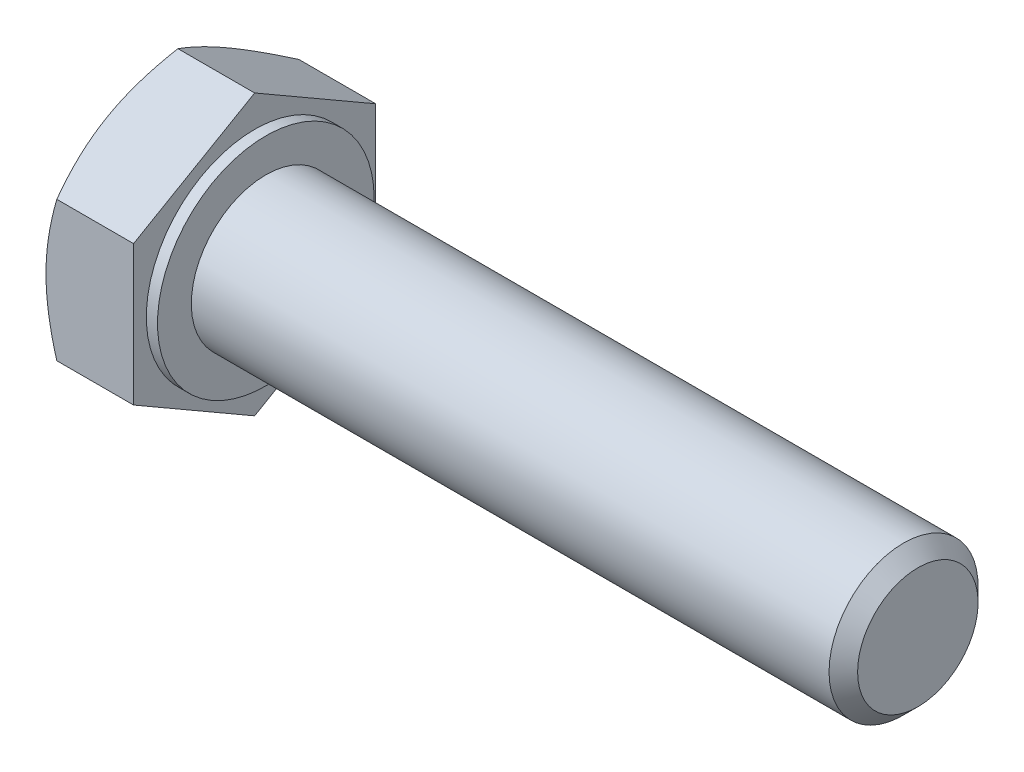
ISO-10303-21;
HEADER;
FILE_DESCRIPTION(('STEP AP214'),'2;1');
FILE_NAME('part.step','',(''),(''),'','','');
FILE_SCHEMA(('AUTOMOTIVE_DESIGN { 1 0 10303 214 1 1 1 1 }'));
ENDSEC;
DATA;
#1=APPLICATION_CONTEXT('core data for automotive mechanical design processes');
#2=APPLICATION_PROTOCOL_DEFINITION('international standard','automotive_design',2000,#1);
#3=PRODUCT_CONTEXT('',#1,'mechanical');
#4=PRODUCT('Part','Part','',(#3));
#5=PRODUCT_RELATED_PRODUCT_CATEGORY('part','',(#4));
#6=PRODUCT_DEFINITION_FORMATION('','',#4);
#7=PRODUCT_DEFINITION_CONTEXT('part definition',#1,'design');
#8=PRODUCT_DEFINITION('design','',#6,#7);
#9=PRODUCT_DEFINITION_SHAPE('','',#8);
#10=(LENGTH_UNIT() NAMED_UNIT(*) SI_UNIT(.MILLI.,.METRE.));
#11=(NAMED_UNIT(*) PLANE_ANGLE_UNIT() SI_UNIT($,.RADIAN.));
#12=(NAMED_UNIT(*) SI_UNIT($,.STERADIAN.) SOLID_ANGLE_UNIT());
#13=UNCERTAINTY_MEASURE_WITH_UNIT(LENGTH_MEASURE(1.E-05),#10,'distance_accuracy_value','');
#14=(GEOMETRIC_REPRESENTATION_CONTEXT(3) GLOBAL_UNCERTAINTY_ASSIGNED_CONTEXT((#13)) GLOBAL_UNIT_ASSIGNED_CONTEXT((#10,
#11,#12)) REPRESENTATION_CONTEXT('',''));
#15=CARTESIAN_POINT('',(0.,0.,0.));
#16=DIRECTION('',(0.,0.,1.));
#17=DIRECTION('',(1.,0.,0.));
#18=AXIS2_PLACEMENT_3D('',#15,#16,#17);
#19=CARTESIAN_POINT('',(35.,2.,0.));
#20=DIRECTION('',(1.,0.,0.));
#21=DIRECTION('',(0.,0.,-1.));
#22=AXIS2_PLACEMENT_3D('',#19,#20,#21);
#23=PLANE('',#22);
#24=CARTESIAN_POINT('',(35.0000000051362,0.,0.));
#25=DIRECTION('',(-1.,0.,0.));
#26=DIRECTION('',(0.,0.,1.));
#27=AXIS2_PLACEMENT_3D('',#24,#25,#26);
#28=CIRCLE('',#27,3.23318750513691);
#29=CARTESIAN_POINT('',(35.0000000051362,0.,3.23318750513691));
#30=VERTEX_POINT('',#29);
#31=EDGE_CURVE('E20',#30,#30,#28,.T.);
#32=ORIENTED_EDGE('',*,*,#31,.F.);
#33=EDGE_LOOP('',(#32));
#34=FACE_BOUND('',#33,.T.);
#35=ADVANCED_FACE('F17',(#34),#23,.T.);
#36=CARTESIAN_POINT('',(-5.30009999999999,0.,0.));
#37=DIRECTION('',(-1.,0.,0.));
#38=DIRECTION('',(0.,0.,1.));
#39=AXIS2_PLACEMENT_3D('',#36,#37,#38);
#40=PLANE('',#39);
#41=CARTESIAN_POINT('',(-5.30010000898123,0.,0.));
#42=DIRECTION('',(1.,0.,0.));
#43=DIRECTION('',(0.,0.,-1.));
#44=AXIS2_PLACEMENT_3D('',#41,#42,#43);
#45=CIRCLE('',#44,6.50000000518535);
#46=CARTESIAN_POINT('',(-5.30010001047811,-5.62916512684417,3.25000000129633));
#47=VERTEX_POINT('',#46);
#48=CARTESIAN_POINT('',(-5.30010001047811,-5.62916512684417,-3.25000000129634));
#49=VERTEX_POINT('',#48);
#50=EDGE_CURVE('E93',#47,#49,#45,.T.);
#51=ORIENTED_EDGE('',*,*,#50,.F.);
#52=CARTESIAN_POINT('',(-5.30010000898123,0.,0.));
#53=DIRECTION('',(1.,0.,0.));
#54=DIRECTION('',(0.,0.,-1.));
#55=AXIS2_PLACEMENT_3D('',#52,#53,#54);
#56=CIRCLE('',#55,6.50000000518535);
#57=CARTESIAN_POINT('',(-5.30010001047811,0.,6.50000000259268));
#58=VERTEX_POINT('',#57);
#59=EDGE_CURVE('E89',#58,#47,#56,.T.);
#60=ORIENTED_EDGE('',*,*,#59,.F.);
#61=CARTESIAN_POINT('',(-5.30010000898123,0.,0.));
#62=DIRECTION('',(1.,0.,0.));
#63=DIRECTION('',(0.,0.,-1.));
#64=AXIS2_PLACEMENT_3D('',#61,#62,#63);
#65=CIRCLE('',#64,6.50000000518535);
#66=CARTESIAN_POINT('',(-5.30010001047811,5.62916512684417,3.25000000129634));
#67=VERTEX_POINT('',#66);
#68=EDGE_CURVE('E86',#67,#58,#65,.T.);
#69=ORIENTED_EDGE('',*,*,#68,.F.);
#70=CARTESIAN_POINT('',(-5.30010000898123,0.,0.));
#71=DIRECTION('',(1.,0.,0.));
#72=DIRECTION('',(0.,0.,-1.));
#73=AXIS2_PLACEMENT_3D('',#70,#71,#72);
#74=CIRCLE('',#73,6.50000000518535);
#75=CARTESIAN_POINT('',(-5.30010001047811,5.62916512684417,-3.25000000129633));
#76=VERTEX_POINT('',#75);
#77=EDGE_CURVE('E165',#76,#67,#74,.T.);
#78=ORIENTED_EDGE('',*,*,#77,.F.);
#79=CARTESIAN_POINT('',(-5.30010000898123,0.,0.));
#80=DIRECTION('',(1.,0.,0.));
#81=DIRECTION('',(0.,0.,-1.));
#82=AXIS2_PLACEMENT_3D('',#79,#80,#81);
#83=CIRCLE('',#82,6.50000000518535);
#84=CARTESIAN_POINT('',(-5.30010001047811,0.,-6.50000000259267));
#85=VERTEX_POINT('',#84);
#86=EDGE_CURVE('E456',#85,#76,#83,.T.);
#87=ORIENTED_EDGE('',*,*,#86,.F.);
#88=CARTESIAN_POINT('',(-5.30010000898123,0.,0.));
#89=DIRECTION('',(1.,0.,0.));
#90=DIRECTION('',(0.,0.,-1.));
#91=AXIS2_PLACEMENT_3D('',#88,#89,#90);
#92=CIRCLE('',#91,6.50000000518535);
#93=EDGE_CURVE('E453',#49,#85,#92,.T.);
#94=ORIENTED_EDGE('',*,*,#93,.F.);
#95=EDGE_LOOP('',(#51,#60,#69,#78,#87,#94));
#96=FACE_BOUND('',#95,.T.);
#97=ADVANCED_FACE('F91',(#96),#40,.T.);
#98=CARTESIAN_POINT('',(35.0000000051362,0.,0.));
#99=DIRECTION('',(-1.,0.,0.));
#100=DIRECTION('',(0.,0.,1.));
#101=AXIS2_PLACEMENT_3D('',#98,#99,#100);
#102=CONICAL_SURFACE('',#101,3.23318750513691,0.785332949264434);
#103=CARTESIAN_POINT('',(34.2330875,0.,0.));
#104=DIRECTION('',(1.,0.,0.));
#105=DIRECTION('',(0.,1.,0.));
#106=AXIS2_PLACEMENT_3D('',#103,#104,#105);
#107=CIRCLE('',#106,4.);
#108=CARTESIAN_POINT('',(34.2330875,4.,0.));
#109=VERTEX_POINT('',#108);
#110=EDGE_CURVE('E164',#109,#109,#107,.F.);
#111=ORIENTED_EDGE('',*,*,#110,.F.);
#112=EDGE_LOOP('',(#111));
#113=FACE_BOUND('',#112,.T.);
#114=ORIENTED_EDGE('',*,*,#31,.T.);
#115=EDGE_LOOP('',(#114));
#116=FACE_BOUND('',#115,.T.);
#117=ADVANCED_FACE('F249',(#113,#116),#102,.T.);
#118=CARTESIAN_POINT('',(-5.30010000898125,0.,0.));
#119=DIRECTION('',(1.,0.,0.));
#120=DIRECTION('',(0.,0.,-1.));
#121=AXIS2_PLACEMENT_3D('',#118,#119,#120);
#122=CONICAL_SURFACE('',#121,6.50000000518531,1.04719753333333);
#123=ORIENTED_EDGE('',*,*,#68,.T.);
#124=CARTESIAN_POINT('',(-4.71954340668286,3.75277674692767,6.50000000221307));
#125=CARTESIAN_POINT('',(-4.80774840365585,3.44730231908242,6.50000000077303));
#126=CARTESIAN_POINT('',(-4.88855958092453,3.13938154220316,6.50000000020205));
#127=CARTESIAN_POINT('',(-5.03106863747488,2.52082569713494,6.49999999979897));
#128=CARTESIAN_POINT('',(-5.09286102786452,2.2102122047342,6.49999999996316));
#129=CARTESIAN_POINT('',(-5.16873159223207,1.74136052832933,6.50000000001844));
#130=CARTESIAN_POINT('',(-5.19122798697328,1.58448437613627,6.50000000000497));
#131=CARTESIAN_POINT('',(-5.23016971523722,1.26998104160387,6.49999999999503));
#132=CARTESIAN_POINT('',(-5.24661520802424,1.11235387914231,6.49999999999858));
#133=CARTESIAN_POINT('',(-5.2731661853354,0.795765480667491,6.50000000000143));
#134=CARTESIAN_POINT('',(-5.28323942821464,0.636801519886692,6.50000000000071));
#135=CARTESIAN_POINT('',(-5.29672028421572,0.318560967675209,6.49999999999929));
#136=CARTESIAN_POINT('',(-5.30012657723065,0.159284320578774,6.49999999999857));
#137=CARTESIAN_POINT('',(-5.30010001197499,2.16049016181027E-10,6.5));
#138=B_SPLINE_CURVE_WITH_KNOTS('',3,(#124,#125,#126,#127,#128,#129,#130,#131,#132,#133,#134,
#135,#136,#137),.UNSPECIFIED.,.F.,.F.,(4,2,2,2,2,2,4),(0.,0.954247656277759,1.90367376254845,
2.37900973852662,2.85433320240958,3.33204281714722,3.80984701246553),.UNSPECIFIED.);
#139=CARTESIAN_POINT('',(-4.71954340534542,3.75277674893481,6.49999999861827));
#140=VERTEX_POINT('',#139);
#141=EDGE_CURVE('E112',#140,#58,#138,.T.);
#142=ORIENTED_EDGE('',*,*,#141,.F.);
#143=CARTESIAN_POINT('',(-5.30010001122656,5.6291651234762,3.24999999935184));
#144=CARTESIAN_POINT('',(-5.30012657696563,5.54952296399172,3.38794426766515));
#145=CARTESIAN_POINT('',(-5.29672028414834,5.46988464071911,3.52588189048444));
#146=CARTESIAN_POINT('',(-5.28323942829044,5.31076436479718,3.80148629339439));
#147=CARTESIAN_POINT('',(-5.27316618535714,5.23128238431505,3.93915312169305));
#148=CARTESIAN_POINT('',(-5.24661520800641,5.07298818500059,4.21332671731589));
#149=CARTESIAN_POINT('',(-5.2301697152341,4.99417460378397,4.34983584435771));
#150=CARTESIAN_POINT('',(-5.19122798697053,4.83692293651991,4.62220372167053));
#151=CARTESIAN_POINT('',(-5.16873159221485,4.75848486041137,4.75806245472683));
#152=CARTESIAN_POINT('',(-5.09286102786408,4.52405902216958,5.16409991714862));
#153=CARTESIAN_POINT('',(-5.03106863756613,4.36875227594089,5.43309909238154));
#154=CARTESIAN_POINT('',(-4.88855958074496,4.05947435339752,5.96878416789935));
#155=CARTESIAN_POINT('',(-4.80774840311014,3.9055139649774,6.23545138300275));
#156=CARTESIAN_POINT('',(-4.71954340523397,3.752776751135,6.4999999975709));
#157=B_SPLINE_CURVE_WITH_KNOTS('',3,(#143,#144,#145,#146,#147,#148,#149,#150,#151,#152,#153,
#154,#155,#156),.UNSPECIFIED.,.F.,.F.,(4,2,2,2,2,2,4),(0.,0.477804195422985,0.955513810240282,
1.43083727416109,1.90617325018841,2.8555993565717,3.80984701303079),.UNSPECIFIED.);
#158=EDGE_CURVE('E106',#67,#140,#157,.T.);
#159=ORIENTED_EDGE('',*,*,#158,.F.);
#160=EDGE_LOOP('',(#123,#142,#159));
#161=FACE_BOUND('',#160,.T.);
#162=ADVANCED_FACE('F111',(#161),#122,.T.);
#163=CARTESIAN_POINT('',(-5.30010000898125,0.,0.));
#164=DIRECTION('',(1.,0.,0.));
#165=DIRECTION('',(0.,0.,-1.));
#166=AXIS2_PLACEMENT_3D('',#163,#164,#165);
#167=CONICAL_SURFACE('',#166,6.50000000518532,1.04719753333333);
#168=CARTESIAN_POINT('',(-5.30010001122656,0.,6.49999999870368));
#169=CARTESIAN_POINT('',(-5.30012657696563,-0.159284320408022,6.49999999953453));
#170=CARTESIAN_POINT('',(-5.29672028414834,-0.31856096754347,6.49999999987529));
#171=CARTESIAN_POINT('',(-5.28323942829044,-0.63680151981929,6.50000000012468));
#172=CARTESIAN_POINT('',(-5.27316618535713,-0.795765480625429,6.50000000003339));
#173=CARTESIAN_POINT('',(-5.2466152080064,-1.11235387913896,6.49999999996677));
#174=CARTESIAN_POINT('',(-5.23016971523409,-1.26998104161393,6.49999999999086));
#175=CARTESIAN_POINT('',(-5.19122798697053,-1.5844843761737,6.50000000000914));
#176=CARTESIAN_POINT('',(-5.16873159221485,-1.74136052838069,6.50000000000332));
#177=CARTESIAN_POINT('',(-5.09286102786407,-2.21021220484703,6.49999999999336));
#178=CARTESIAN_POINT('',(-5.03106863756612,-2.52082569731014,6.49999999999667));
#179=CARTESIAN_POINT('',(-4.88855958074495,-3.13938154240843,6.50000000000334));
#180=CARTESIAN_POINT('',(-4.80774840311014,-3.44730231925449,6.5000000000067));
#181=CARTESIAN_POINT('',(-4.71954340523397,-3.75277674692768,6.5));
#182=B_SPLINE_CURVE_WITH_KNOTS('',3,(#168,#169,#170,#171,#172,#173,#174,#175,#176,#177,#178,
#179,#180,#181),.UNSPECIFIED.,.F.,.F.,(4,2,2,2,2,2,4),(0.,0.477804195422984,0.955513810240282,
1.43083727416109,1.90617325018841,2.8555993565717,3.80984701303079),.UNSPECIFIED.);
#183=CARTESIAN_POINT('',(-4.71954340534542,-3.75277674893483,6.49999999861826));
#184=VERTEX_POINT('',#183);
#185=EDGE_CURVE('E99',#58,#184,#182,.T.);
#186=ORIENTED_EDGE('',*,*,#185,.F.);
#187=ORIENTED_EDGE('',*,*,#59,.T.);
#188=CARTESIAN_POINT('',(-4.71954340668286,-3.75277675305158,6.49999999867742));
#189=CARTESIAN_POINT('',(-4.80774840365585,-3.9055139657271,6.2354513832369));
#190=CARTESIAN_POINT('',(-4.88855958092453,-4.05947435367225,5.96878416782093));
#191=CARTESIAN_POINT('',(-5.03106863747488,-4.36875227585728,5.43309909213096));
#192=CARTESIAN_POINT('',(-5.09286102786452,-4.52405902219984,5.16409991703581));
#193=CARTESIAN_POINT('',(-5.16873159223208,-4.75848486045016,4.75806245468991));
#194=CARTESIAN_POINT('',(-5.19122798697328,-4.83692293653501,4.62220372163603));
#195=CARTESIAN_POINT('',(-5.23016971523722,-4.99417460379261,4.34983584435109));
#196=CARTESIAN_POINT('',(-5.24661520802424,-5.07298818502646,4.21332671733469));
#197=CARTESIAN_POINT('',(-5.2731661853354,-5.23128238426634,3.93915312171349));
#198=CARTESIAN_POINT('',(-5.28323942821465,-5.31076436465612,3.80148629339077));
#199=CARTESIAN_POINT('',(-5.29672028421573,-5.46988464076062,3.52588189066052));
#200=CARTESIAN_POINT('',(-5.30012657723065,-5.54952296430822,3.38794426804504));
#201=CARTESIAN_POINT('',(-5.30010001197499,-5.62916512449082,3.2500000001871));
#202=B_SPLINE_CURVE_WITH_KNOTS('',3,(#188,#189,#190,#191,#192,#193,#194,#195,#196,#197,#198,
#199,#200,#201),.UNSPECIFIED.,.F.,.F.,(4,2,2,2,2,2,4),(0.,0.95424765627776,1.90367376254845,
2.37900973852662,2.85433320240958,3.33204281714723,3.80984701246553),.UNSPECIFIED.);
#203=EDGE_CURVE('E101',#184,#47,#202,.T.);
#204=ORIENTED_EDGE('',*,*,#203,.F.);
#205=EDGE_LOOP('',(#186,#187,#204));
#206=FACE_BOUND('',#205,.T.);
#207=ADVANCED_FACE('F100',(#206),#167,.T.);
#208=CARTESIAN_POINT('',(-5.30010000898125,0.,0.));
#209=DIRECTION('',(1.,0.,0.));
#210=DIRECTION('',(0.,0.,-1.));
#211=AXIS2_PLACEMENT_3D('',#208,#209,#210);
#212=CONICAL_SURFACE('',#211,6.50000000518532,1.04719753333333);
#213=CARTESIAN_POINT('',(-5.30010001122656,-5.6291651234762,3.24999999935183));
#214=CARTESIAN_POINT('',(-5.30012657696563,-5.70880728439975,3.11205573186937));
#215=CARTESIAN_POINT('',(-5.29672028414834,-5.78844560826258,2.97411810939085));
#216=CARTESIAN_POINT('',(-5.28323942829044,-5.94756588461647,2.69851370673029));
#217=CARTESIAN_POINT('',(-5.27316618535714,-6.02704786494048,2.56084687834034));
#218=CARTESIAN_POINT('',(-5.24661520800641,-6.18534206413955,2.28667328265088));
#219=CARTESIAN_POINT('',(-5.2301697152341,-6.2641556453979,2.15016415563315));
#220=CARTESIAN_POINT('',(-5.19122798697053,-6.42140731269361,1.87779627833861));
#221=CARTESIAN_POINT('',(-5.16873159221485,-6.49984538879207,1.74193754527649));
#222=CARTESIAN_POINT('',(-5.09286102786408,-6.73427122701661,1.33590008284474));
#223=CARTESIAN_POINT('',(-5.03106863756613,-6.88957797325103,1.06690090761513));
#224=CARTESIAN_POINT('',(-4.88855958074496,-7.19885589580595,0.531215832103997));
#225=CARTESIAN_POINT('',(-4.80774840311015,-7.35281628423189,0.264548617003951));
#226=CARTESIAN_POINT('',(-4.71954340523397,-7.50555349806268,2.42910158015695E-09));
#227=B_SPLINE_CURVE_WITH_KNOTS('',3,(#213,#214,#215,#216,#217,#218,#219,#220,#221,#222,#223,
#224,#225,#226),.UNSPECIFIED.,.F.,.F.,(4,2,2,2,2,2,4),(0.,0.477804195422983,0.955513810240279,
1.43083727416109,1.90617325018841,2.85559935657169,3.80984701303078),.UNSPECIFIED.);
#228=CARTESIAN_POINT('',(-4.71954340534542,-7.50555349786964,0.));
#229=VERTEX_POINT('',#228);
#230=EDGE_CURVE('E117',#47,#229,#227,.T.);
#231=ORIENTED_EDGE('',*,*,#230,.F.);
#232=ORIENTED_EDGE('',*,*,#50,.T.);
#233=CARTESIAN_POINT('',(-4.71954340668286,-7.50555349997926,-3.53563921064261E-09));
#234=CARTESIAN_POINT('',(-4.80774840365585,-7.35281628480953,-0.264548617536125));
#235=CARTESIAN_POINT('',(-4.88855958092453,-7.19885589587541,-0.531215832381117));
#236=CARTESIAN_POINT('',(-5.03106863747488,-6.88957797299223,-1.06690090766801));
#237=CARTESIAN_POINT('',(-5.09286102786452,-6.73427122693405,-1.33590008292735));
#238=CARTESIAN_POINT('',(-5.16873159223207,-6.49984538877949,-1.74193754532853));
#239=CARTESIAN_POINT('',(-5.19122798697328,-6.42140731267129,-1.87779627836893));
#240=CARTESIAN_POINT('',(-5.23016971523722,-6.26415564539649,-2.15016415564394));
#241=CARTESIAN_POINT('',(-5.24661520802424,-6.18534206416878,-2.28667328266388));
#242=CARTESIAN_POINT('',(-5.2731661853354,-6.02704786493383,-2.56084687828793));
#243=CARTESIAN_POINT('',(-5.28323942821465,-5.94756588454282,-2.69851370660994));
#244=CARTESIAN_POINT('',(-5.29672028421572,-5.78844560843584,-2.97411810933876));
#245=CARTESIAN_POINT('',(-5.30012657723065,-5.708807284887,-3.11205573195352));
#246=CARTESIAN_POINT('',(-5.30010001197499,-5.62916512470688,-3.24999999981289));
#247=B_SPLINE_CURVE_WITH_KNOTS('',3,(#233,#234,#235,#236,#237,#238,#239,#240,#241,#242,#243,
#244,#245,#246),.UNSPECIFIED.,.F.,.F.,(4,2,2,2,2,2,4),(0.,0.95424765627776,1.90367376254845,
2.37900973852662,2.85433320240958,3.33204281714723,3.80984701246553),.UNSPECIFIED.);
#248=EDGE_CURVE('E219',#229,#49,#247,.T.);
#249=ORIENTED_EDGE('',*,*,#248,.F.);
#250=EDGE_LOOP('',(#231,#232,#249));
#251=FACE_BOUND('',#250,.T.);
#252=ADVANCED_FACE('F227',(#251),#212,.T.);
#253=CARTESIAN_POINT('',(-5.30010000898124,0.,0.));
#254=DIRECTION('',(1.,0.,0.));
#255=DIRECTION('',(0.,0.,-1.));
#256=AXIS2_PLACEMENT_3D('',#253,#254,#255);
#257=CONICAL_SURFACE('',#256,6.50000000518532,1.04719753333333);
#258=CARTESIAN_POINT('',(-5.30010001122656,-5.6291651234762,-3.24999999935184));
#259=CARTESIAN_POINT('',(-5.30012657696563,-5.54952296399173,-3.38794426766515));
#260=CARTESIAN_POINT('',(-5.29672028414834,-5.46988464071912,-3.52588189048444));
#261=CARTESIAN_POINT('',(-5.28323942829044,-5.31076436479718,-3.80148629339438));
#262=CARTESIAN_POINT('',(-5.27316618535713,-5.23128238431506,-3.93915312169305));
#263=CARTESIAN_POINT('',(-5.2466152080064,-5.07298818500059,-4.21332671731589));
#264=CARTESIAN_POINT('',(-5.23016971523409,-4.99417460378397,-4.34983584435771));
#265=CARTESIAN_POINT('',(-5.19122798697053,-4.83692293651992,-4.62220372167053));
#266=CARTESIAN_POINT('',(-5.16873159221485,-4.75848486041138,-4.75806245472683));
#267=CARTESIAN_POINT('',(-5.09286102786407,-4.52405902216959,-5.16409991714862));
#268=CARTESIAN_POINT('',(-5.03106863756613,-4.3687522759409,-5.43309909238154));
#269=CARTESIAN_POINT('',(-4.88855958074496,-4.05947435339753,-5.96878416789934));
#270=CARTESIAN_POINT('',(-4.80774840311014,-3.90551396497741,-6.23545138300275));
#271=CARTESIAN_POINT('',(-4.71954340523397,-3.75277675113501,-6.49999999757089));
#272=B_SPLINE_CURVE_WITH_KNOTS('',3,(#258,#259,#260,#261,#262,#263,#264,#265,#266,#267,#268,
#269,#270,#271),.UNSPECIFIED.,.F.,.F.,(4,2,2,2,2,2,4),(0.,0.477804195422983,0.95551381024028,
1.43083727416109,1.90617325018841,2.85559935657169,3.80984701303079),.UNSPECIFIED.);
#273=CARTESIAN_POINT('',(-4.71954340534542,-3.75277674893482,-6.49999999861827));
#274=VERTEX_POINT('',#273);
#275=EDGE_CURVE('E231',#49,#274,#272,.T.);
#276=ORIENTED_EDGE('',*,*,#275,.F.);
#277=ORIENTED_EDGE('',*,*,#93,.T.);
#278=CARTESIAN_POINT('',(-4.71954340668286,-3.75277674692767,-6.50000000221306));
#279=CARTESIAN_POINT('',(-4.80774840365585,-3.44730231908243,-6.50000000077303));
#280=CARTESIAN_POINT('',(-4.88855958092453,-3.13938154220316,-6.50000000020205));
#281=CARTESIAN_POINT('',(-5.03106863747488,-2.52082569713495,-6.49999999979897));
#282=CARTESIAN_POINT('',(-5.09286102786452,-2.21021220473421,-6.49999999996316));
#283=CARTESIAN_POINT('',(-5.16873159223207,-1.74136052832934,-6.50000000001844));
#284=CARTESIAN_POINT('',(-5.19122798697328,-1.58448437613628,-6.50000000000497));
#285=CARTESIAN_POINT('',(-5.23016971523722,-1.26998104160387,-6.49999999999503));
#286=CARTESIAN_POINT('',(-5.24661520802424,-1.11235387914232,-6.49999999999858));
#287=CARTESIAN_POINT('',(-5.2731661853354,-0.795765480667496,-6.50000000000143));
#288=CARTESIAN_POINT('',(-5.28323942821464,-0.636801519886697,-6.50000000000071));
#289=CARTESIAN_POINT('',(-5.29672028421572,-0.318560967675214,-6.49999999999929));
#290=CARTESIAN_POINT('',(-5.30012657723065,-0.15928432057878,-6.49999999999857));
#291=CARTESIAN_POINT('',(-5.30010001197499,-2.16054349235661E-10,-6.5));
#292=B_SPLINE_CURVE_WITH_KNOTS('',3,(#278,#279,#280,#281,#282,#283,#284,#285,#286,#287,#288,
#289,#290,#291),.UNSPECIFIED.,.F.,.F.,(4,2,2,2,2,2,4),(0.,0.95424765627776,1.90367376254845,
2.37900973852662,2.85433320240958,3.33204281714722,3.80984701246553),.UNSPECIFIED.);
#293=EDGE_CURVE('E213',#274,#85,#292,.T.);
#294=ORIENTED_EDGE('',*,*,#293,.F.);
#295=EDGE_LOOP('',(#276,#277,#294));
#296=FACE_BOUND('',#295,.T.);
#297=ADVANCED_FACE('F224',(#296),#257,.T.);
#298=CARTESIAN_POINT('',(-5.30010000898125,0.,0.));
#299=DIRECTION('',(1.,0.,0.));
#300=DIRECTION('',(0.,0.,-1.));
#301=AXIS2_PLACEMENT_3D('',#298,#299,#300);
#302=CONICAL_SURFACE('',#301,6.50000000518532,1.04719753333333);
#303=ORIENTED_EDGE('',*,*,#86,.T.);
#304=CARTESIAN_POINT('',(-4.71954340668286,3.75277675305158,-6.49999999867743));
#305=CARTESIAN_POINT('',(-4.80774840365585,3.9055139657271,-6.23545138323691));
#306=CARTESIAN_POINT('',(-4.88855958092453,4.05947435367225,-5.96878416782093));
#307=CARTESIAN_POINT('',(-5.03106863747488,4.36875227585728,-5.43309909213096));
#308=CARTESIAN_POINT('',(-5.09286102786452,4.52405902219984,-5.16409991703581));
#309=CARTESIAN_POINT('',(-5.16873159223208,4.75848486045015,-4.75806245468992));
#310=CARTESIAN_POINT('',(-5.19122798697328,4.83692293653501,-4.62220372163604));
#311=CARTESIAN_POINT('',(-5.23016971523722,4.99417460379261,-4.34983584435109));
#312=CARTESIAN_POINT('',(-5.24661520802424,5.07298818502646,-4.2133267173347));
#313=CARTESIAN_POINT('',(-5.2731661853354,5.23128238426634,-3.9391531217135));
#314=CARTESIAN_POINT('',(-5.28323942821465,5.31076436465612,-3.80148629339077));
#315=CARTESIAN_POINT('',(-5.29672028421573,5.46988464076062,-3.52588189066053));
#316=CARTESIAN_POINT('',(-5.30012657723065,5.54952296430822,-3.38794426804505));
#317=CARTESIAN_POINT('',(-5.30010001197499,5.62916512449082,-3.2500000001871));
#318=B_SPLINE_CURVE_WITH_KNOTS('',3,(#304,#305,#306,#307,#308,#309,#310,#311,#312,#313,#314,
#315,#316,#317),.UNSPECIFIED.,.F.,.F.,(4,2,2,2,2,2,4),(0.,0.95424765627776,1.90367376254845,
2.37900973852662,2.85433320240958,3.33204281714723,3.80984701246554),.UNSPECIFIED.);
#319=CARTESIAN_POINT('',(-4.71954340534542,3.75277674893482,-6.49999999861827));
#320=VERTEX_POINT('',#319);
#321=EDGE_CURVE('E186',#320,#76,#318,.T.);
#322=ORIENTED_EDGE('',*,*,#321,.F.);
#323=CARTESIAN_POINT('',(-5.30010001122656,0.,-6.49999999870368));
#324=CARTESIAN_POINT('',(-5.30012657696563,0.159284320408018,-6.49999999953453));
#325=CARTESIAN_POINT('',(-5.29672028414834,0.318560967543466,-6.49999999987529));
#326=CARTESIAN_POINT('',(-5.28323942829044,0.636801519819286,-6.50000000012468));
#327=CARTESIAN_POINT('',(-5.27316618535713,0.795765480625425,-6.50000000003339));
#328=CARTESIAN_POINT('',(-5.2466152080064,1.11235387913896,-6.49999999996677));
#329=CARTESIAN_POINT('',(-5.23016971523409,1.26998104161392,-6.49999999999086));
#330=CARTESIAN_POINT('',(-5.19122798697053,1.58448437617369,-6.50000000000914));
#331=CARTESIAN_POINT('',(-5.16873159221485,1.74136052838069,-6.50000000000332));
#332=CARTESIAN_POINT('',(-5.09286102786407,2.21021220484702,-6.49999999999336));
#333=CARTESIAN_POINT('',(-5.03106863756612,2.52082569731014,-6.49999999999667));
#334=CARTESIAN_POINT('',(-4.88855958074496,3.13938154240842,-6.50000000000334));
#335=CARTESIAN_POINT('',(-4.80774840311014,3.44730231925448,-6.5000000000067));
#336=CARTESIAN_POINT('',(-4.71954340523397,3.75277674692768,-6.5));
#337=B_SPLINE_CURVE_WITH_KNOTS('',3,(#323,#324,#325,#326,#327,#328,#329,#330,#331,#332,#333,
#334,#335,#336),.UNSPECIFIED.,.F.,.F.,(4,2,2,2,2,2,4),(0.,0.477804195422985,0.955513810240282,
1.43083727416109,1.90617325018841,2.8555993565717,3.80984701303079),.UNSPECIFIED.);
#338=EDGE_CURVE('E208',#85,#320,#337,.T.);
#339=ORIENTED_EDGE('',*,*,#338,.F.);
#340=EDGE_LOOP('',(#303,#322,#339));
#341=FACE_BOUND('',#340,.T.);
#342=ADVANCED_FACE('F171',(#341),#302,.T.);
#343=CARTESIAN_POINT('',(-5.30010000898125,0.,0.));
#344=DIRECTION('',(1.,0.,0.));
#345=DIRECTION('',(0.,0.,-1.));
#346=AXIS2_PLACEMENT_3D('',#343,#344,#345);
#347=CONICAL_SURFACE('',#346,6.50000000518531,1.04719753333333);
#348=ORIENTED_EDGE('',*,*,#77,.T.);
#349=CARTESIAN_POINT('',(-4.71954340668286,7.50555349997926,3.53564084966106E-09));
#350=CARTESIAN_POINT('',(-4.80774840365585,7.35281628480953,0.264548617536126));
#351=CARTESIAN_POINT('',(-4.88855958092453,7.19885589587541,0.531215832381118));
#352=CARTESIAN_POINT('',(-5.03106863747488,6.88957797299222,1.06690090766801));
#353=CARTESIAN_POINT('',(-5.09286102786452,6.73427122693405,1.33590008292735));
#354=CARTESIAN_POINT('',(-5.16873159223207,6.49984538877949,1.74193754532853));
#355=CARTESIAN_POINT('',(-5.19122798697328,6.42140731267129,1.87779627836893));
#356=CARTESIAN_POINT('',(-5.23016971523722,6.26415564539648,2.15016415564394));
#357=CARTESIAN_POINT('',(-5.24661520802424,6.18534206416877,2.28667328266388));
#358=CARTESIAN_POINT('',(-5.2731661853354,6.02704786493383,2.56084687828793));
#359=CARTESIAN_POINT('',(-5.28323942821465,5.94756588454281,2.69851370660994));
#360=CARTESIAN_POINT('',(-5.29672028421573,5.78844560843583,2.97411810933876));
#361=CARTESIAN_POINT('',(-5.30012657723065,5.70880728488699,3.11205573195352));
#362=CARTESIAN_POINT('',(-5.30010001197499,5.62916512470687,3.2499999998129));
#363=B_SPLINE_CURVE_WITH_KNOTS('',3,(#349,#350,#351,#352,#353,#354,#355,#356,#357,#358,#359,
#360,#361,#362),.UNSPECIFIED.,.F.,.F.,(4,2,2,2,2,2,4),(0.,0.954247656277761,1.90367376254845,
2.37900973852662,2.85433320240958,3.33204281714723,3.80984701246554),.UNSPECIFIED.);
#364=CARTESIAN_POINT('',(-4.71954340488485,7.50555349866739,1.38173762436914E-09));
#365=VERTEX_POINT('',#364);
#366=EDGE_CURVE('E159',#365,#67,#363,.T.);
#367=ORIENTED_EDGE('',*,*,#366,.F.);
#368=CARTESIAN_POINT('',(-5.30010001122656,5.6291651234762,-3.24999999935183));
#369=CARTESIAN_POINT('',(-5.30012657696563,5.70880728439975,-3.11205573186937));
#370=CARTESIAN_POINT('',(-5.29672028414834,5.78844560826258,-2.97411810939085));
#371=CARTESIAN_POINT('',(-5.28323942829044,5.94756588461647,-2.69851370673029));
#372=CARTESIAN_POINT('',(-5.27316618535714,6.02704786494048,-2.56084687834034));
#373=CARTESIAN_POINT('',(-5.24661520800641,6.18534206413955,-2.28667328265088));
#374=CARTESIAN_POINT('',(-5.23016971523409,6.2641556453979,-2.15016415563315));
#375=CARTESIAN_POINT('',(-5.19122798697053,6.42140731269361,-1.87779627833861));
#376=CARTESIAN_POINT('',(-5.16873159221485,6.49984538879207,-1.74193754527649));
#377=CARTESIAN_POINT('',(-5.09286102786408,6.73427122701661,-1.33590008284474));
#378=CARTESIAN_POINT('',(-5.03106863756613,6.88957797325104,-1.06690090761513));
#379=CARTESIAN_POINT('',(-4.88855958074496,7.19885589580596,-0.531215832103998));
#380=CARTESIAN_POINT('',(-4.80774840311015,7.3528162842319,-0.264548617003952));
#381=CARTESIAN_POINT('',(-4.71954340523397,7.50555349806269,-2.42910178205261E-09));
#382=B_SPLINE_CURVE_WITH_KNOTS('',3,(#368,#369,#370,#371,#372,#373,#374,#375,#376,#377,#378,
#379,#380,#381),.UNSPECIFIED.,.F.,.F.,(4,2,2,2,2,2,4),(0.,0.477804195422985,0.955513810240282,
1.43083727416109,1.90617325018841,2.8555993565717,3.80984701303078),.UNSPECIFIED.);
#383=EDGE_CURVE('E177',#76,#365,#382,.T.);
#384=ORIENTED_EDGE('',*,*,#383,.F.);
#385=EDGE_LOOP('',(#348,#367,#384));
#386=FACE_BOUND('',#385,.T.);
#387=ADVANCED_FACE('F167',(#386),#347,.T.);
#388=CARTESIAN_POINT('',(0.,0.,0.));
#389=DIRECTION('',(1.,0.,0.));
#390=DIRECTION('',(0.,1.,0.));
#391=AXIS2_PLACEMENT_3D('',#388,#389,#390);
#392=CYLINDRICAL_SURFACE('',#391,4.);
#393=ORIENTED_EDGE('',*,*,#110,.T.);
#394=EDGE_LOOP('',(#393));
#395=FACE_BOUND('',#394,.T.);
#396=CARTESIAN_POINT('',(0.,0.,0.));
#397=DIRECTION('',(1.,0.,0.));
#398=DIRECTION('',(0.,1.,0.));
#399=AXIS2_PLACEMENT_3D('',#396,#397,#398);
#400=CIRCLE('',#399,4.);
#401=CARTESIAN_POINT('',(0.,4.,0.));
#402=VERTEX_POINT('',#401);
#403=EDGE_CURVE('E187',#402,#402,#400,.F.);
#404=ORIENTED_EDGE('',*,*,#403,.F.);
#405=EDGE_LOOP('',(#404));
#406=FACE_BOUND('',#405,.T.);
#407=ADVANCED_FACE('F151',(#395,#406),#392,.T.);
#408=CARTESIAN_POINT('',(-0.600099999999995,7.50555349946513,0.));
#409=DIRECTION('',(0.,0.866025403784438,0.500000000000001));
#410=DIRECTION('',(0.,-0.500000000000001,0.866025403784438));
#411=AXIS2_PLACEMENT_3D('',#408,#409,#410);
#412=PLANE('',#411);
#413=DIRECTION('',(0.,-0.500000000000001,0.866025403784438));
#414=VECTOR('',#413,1.);
#415=CARTESIAN_POINT('',(-0.600099999999994,7.50555349946513,0.));
#416=LINE('',#415,#414);
#417=CARTESIAN_POINT('',(-0.600099999999995,7.50555349946513,0.));
#418=VERTEX_POINT('',#417);
#419=CARTESIAN_POINT('',(-0.600099999999994,3.75277674973256,6.5));
#420=VERTEX_POINT('',#419);
#421=EDGE_CURVE('E277',#418,#420,#416,.T.);
#422=ORIENTED_EDGE('',*,*,#421,.F.);
#423=DIRECTION('',(1.,0.,0.));
#424=VECTOR('',#423,1.);
#425=CARTESIAN_POINT('',(-0.600099999999994,7.50555349946513,0.));
#426=LINE('',#425,#424);
#427=EDGE_CURVE('E185',#365,#418,#426,.T.);
#428=ORIENTED_EDGE('',*,*,#427,.F.);
#429=ORIENTED_EDGE('',*,*,#366,.T.);
#430=ORIENTED_EDGE('',*,*,#158,.T.);
#431=DIRECTION('',(1.,0.,0.));
#432=VECTOR('',#431,1.);
#433=CARTESIAN_POINT('',(-0.600099999999994,3.75277674973256,6.5));
#434=LINE('',#433,#432);
#435=EDGE_CURVE('E105',#420,#140,#434,.F.);
#436=ORIENTED_EDGE('',*,*,#435,.F.);
#437=EDGE_LOOP('',(#422,#428,#429,#430,#436));
#438=FACE_BOUND('',#437,.T.);
#439=ADVANCED_FACE('F144',(#438),#412,.T.);
#440=CARTESIAN_POINT('',(-0.600099999999994,3.75277674973256,6.5));
#441=DIRECTION('',(0.,0.,1.));
#442=DIRECTION('',(1.,0.,0.));
#443=AXIS2_PLACEMENT_3D('',#440,#441,#442);
#444=PLANE('',#443);
#445=ORIENTED_EDGE('',*,*,#435,.T.);
#446=ORIENTED_EDGE('',*,*,#141,.T.);
#447=ORIENTED_EDGE('',*,*,#185,.T.);
#448=DIRECTION('',(1.,0.,0.));
#449=VECTOR('',#448,1.);
#450=CARTESIAN_POINT('',(-0.600099999999993,-3.75277674973257,6.49999999999999));
#451=LINE('',#450,#449);
#452=CARTESIAN_POINT('',(-0.600099999999994,-3.75277674973257,6.49999999999999));
#453=VERTEX_POINT('',#452);
#454=EDGE_CURVE('E119',#453,#184,#451,.F.);
#455=ORIENTED_EDGE('',*,*,#454,.F.);
#456=DIRECTION('',(0.,1.,0.));
#457=VECTOR('',#456,1.);
#458=CARTESIAN_POINT('',(-0.600099999999994,0.,6.5));
#459=LINE('',#458,#457);
#460=EDGE_CURVE('E273',#420,#453,#459,.F.);
#461=ORIENTED_EDGE('',*,*,#460,.F.);
#462=EDGE_LOOP('',(#445,#446,#447,#455,#461));
#463=FACE_BOUND('',#462,.T.);
#464=ADVANCED_FACE('F115',(#463),#444,.T.);
#465=CARTESIAN_POINT('',(-0.600099999999993,-3.75277674973257,6.49999999999999));
#466=DIRECTION('',(0.,-0.866025403784439,0.499999999999999));
#467=DIRECTION('',(0.,-0.499999999999999,-0.866025403784439));
#468=AXIS2_PLACEMENT_3D('',#465,#466,#467);
#469=PLANE('',#468);
#470=ORIENTED_EDGE('',*,*,#454,.T.);
#471=ORIENTED_EDGE('',*,*,#203,.T.);
#472=ORIENTED_EDGE('',*,*,#230,.T.);
#473=DIRECTION('',(1.,0.,0.));
#474=VECTOR('',#473,1.);
#475=CARTESIAN_POINT('',(-0.600099999999993,-7.50555349946513,0.));
#476=LINE('',#475,#474);
#477=CARTESIAN_POINT('',(-0.600099999999994,-7.50555349946513,0.));
#478=VERTEX_POINT('',#477);
#479=EDGE_CURVE('E236',#478,#229,#476,.F.);
#480=ORIENTED_EDGE('',*,*,#479,.F.);
#481=DIRECTION('',(0.,-0.5,-0.866025403784439));
#482=VECTOR('',#481,1.);
#483=CARTESIAN_POINT('',(-0.600099999999994,-3.75277674973257,6.49999999999999));
#484=LINE('',#483,#482);
#485=EDGE_CURVE('E276',#453,#478,#484,.T.);
#486=ORIENTED_EDGE('',*,*,#485,.F.);
#487=EDGE_LOOP('',(#470,#471,#472,#480,#486));
#488=FACE_BOUND('',#487,.T.);
#489=ADVANCED_FACE('F143',(#488),#469,.T.);
#490=CARTESIAN_POINT('',(-0.600099999999993,-7.50555349946513,0.));
#491=DIRECTION('',(0.,-0.866025403784439,-0.5));
#492=DIRECTION('',(0.,0.5,-0.866025403784438));
#493=AXIS2_PLACEMENT_3D('',#490,#491,#492);
#494=PLANE('',#493);
#495=ORIENTED_EDGE('',*,*,#479,.T.);
#496=ORIENTED_EDGE('',*,*,#248,.T.);
#497=ORIENTED_EDGE('',*,*,#275,.T.);
#498=DIRECTION('',(-1.,0.,0.));
#499=VECTOR('',#498,1.);
#500=CARTESIAN_POINT('',(-0.600099999999993,-3.75277674973256,-6.5));
#501=LINE('',#500,#499);
#502=CARTESIAN_POINT('',(-0.600099999999994,-3.75277674973256,-6.5));
#503=VERTEX_POINT('',#502);
#504=EDGE_CURVE('E308',#503,#274,#501,.T.);
#505=ORIENTED_EDGE('',*,*,#504,.F.);
#506=DIRECTION('',(0.,0.5,-0.866025403784438));
#507=VECTOR('',#506,1.);
#508=CARTESIAN_POINT('',(-0.600099999999994,-7.50555349946513,0.));
#509=LINE('',#508,#507);
#510=EDGE_CURVE('E282',#478,#503,#509,.T.);
#511=ORIENTED_EDGE('',*,*,#510,.F.);
#512=EDGE_LOOP('',(#495,#496,#497,#505,#511));
#513=FACE_BOUND('',#512,.T.);
#514=ADVANCED_FACE('F205',(#513),#494,.T.);
#515=CARTESIAN_POINT('',(-0.600099999999993,-3.75277674973256,-6.5));
#516=DIRECTION('',(0.,0.,-1.));
#517=DIRECTION('',(-1.,0.,0.));
#518=AXIS2_PLACEMENT_3D('',#515,#516,#517);
#519=PLANE('',#518);
#520=DIRECTION('',(0.,1.,0.));
#521=VECTOR('',#520,1.);
#522=CARTESIAN_POINT('',(-0.600099999999994,0.,-6.5));
#523=LINE('',#522,#521);
#524=CARTESIAN_POINT('',(-0.600099999999995,3.75277674973257,-6.49999999999999));
#525=VERTEX_POINT('',#524);
#526=EDGE_CURVE('E266',#503,#525,#523,.T.);
#527=ORIENTED_EDGE('',*,*,#526,.F.);
#528=ORIENTED_EDGE('',*,*,#504,.T.);
#529=ORIENTED_EDGE('',*,*,#293,.T.);
#530=ORIENTED_EDGE('',*,*,#338,.T.);
#531=DIRECTION('',(1.,0.,0.));
#532=VECTOR('',#531,1.);
#533=CARTESIAN_POINT('',(-0.600099999999994,3.75277674973257,-6.49999999999999));
#534=LINE('',#533,#532);
#535=EDGE_CURVE('E35',#525,#320,#534,.F.);
#536=ORIENTED_EDGE('',*,*,#535,.F.);
#537=EDGE_LOOP('',(#527,#528,#529,#530,#536));
#538=FACE_BOUND('',#537,.T.);
#539=ADVANCED_FACE('F199',(#538),#519,.T.);
#540=CARTESIAN_POINT('',(-0.600099999999994,3.75277674973257,-6.49999999999999));
#541=DIRECTION('',(0.,0.866025403784439,-0.5));
#542=DIRECTION('',(0.,0.5,0.866025403784439));
#543=AXIS2_PLACEMENT_3D('',#540,#541,#542);
#544=PLANE('',#543);
#545=DIRECTION('',(0.,0.499999999999999,0.866025403784439));
#546=VECTOR('',#545,1.);
#547=CARTESIAN_POINT('',(-0.600099999999994,3.75277674973257,-6.49999999999999));
#548=LINE('',#547,#546);
#549=EDGE_CURVE('E264',#525,#418,#548,.T.);
#550=ORIENTED_EDGE('',*,*,#549,.F.);
#551=ORIENTED_EDGE('',*,*,#535,.T.);
#552=ORIENTED_EDGE('',*,*,#321,.T.);
#553=ORIENTED_EDGE('',*,*,#383,.T.);
#554=ORIENTED_EDGE('',*,*,#427,.T.);
#555=EDGE_LOOP('',(#550,#551,#552,#553,#554));
#556=FACE_BOUND('',#555,.T.);
#557=ADVANCED_FACE('F193',(#556),#544,.T.);
#558=CARTESIAN_POINT('',(0.,4.9075,0.));
#559=DIRECTION('',(1.,0.,0.));
#560=DIRECTION('',(0.,0.,-1.));
#561=AXIS2_PLACEMENT_3D('',#558,#559,#560);
#562=PLANE('',#561);
#563=ORIENTED_EDGE('',*,*,#403,.T.);
#564=EDGE_LOOP('',(#563));
#565=FACE_BOUND('',#564,.T.);
#566=CARTESIAN_POINT('',(0.,0.,0.));
#567=DIRECTION('',(1.,0.,0.));
#568=DIRECTION('',(0.,0.,-1.));
#569=AXIS2_PLACEMENT_3D('',#566,#567,#568);
#570=CIRCLE('',#569,5.815);
#571=CARTESIAN_POINT('',(0.,0.,-5.815));
#572=VERTEX_POINT('',#571);
#573=EDGE_CURVE('E26',#572,#572,#570,.F.);
#574=ORIENTED_EDGE('',*,*,#573,.F.);
#575=EDGE_LOOP('',(#574));
#576=FACE_BOUND('',#575,.T.);
#577=ADVANCED_FACE('F198',(#565,#576),#562,.T.);
#578=CARTESIAN_POINT('',(-0.600099999999994,0.,0.));
#579=DIRECTION('',(1.,0.,0.));
#580=DIRECTION('',(0.,0.,-1.));
#581=AXIS2_PLACEMENT_3D('',#578,#579,#580);
#582=PLANE('',#581);
#583=CARTESIAN_POINT('',(-0.600099999999991,0.,0.));
#584=DIRECTION('',(1.,0.,0.));
#585=DIRECTION('',(0.,0.,-1.));
#586=AXIS2_PLACEMENT_3D('',#583,#584,#585);
#587=CIRCLE('',#586,5.815);
#588=CARTESIAN_POINT('',(-0.600099999999991,0.,-5.815));
#589=VERTEX_POINT('',#588);
#590=EDGE_CURVE('E11',#589,#589,#587,.T.);
#591=ORIENTED_EDGE('',*,*,#590,.F.);
#592=EDGE_LOOP('',(#591));
#593=FACE_BOUND('',#592,.T.);
#594=ORIENTED_EDGE('',*,*,#526,.T.);
#595=ORIENTED_EDGE('',*,*,#549,.T.);
#596=ORIENTED_EDGE('',*,*,#421,.T.);
#597=ORIENTED_EDGE('',*,*,#460,.T.);
#598=ORIENTED_EDGE('',*,*,#485,.T.);
#599=ORIENTED_EDGE('',*,*,#510,.T.);
#600=EDGE_LOOP('',(#594,#595,#596,#597,#598,#599));
#601=FACE_BOUND('',#600,.T.);
#602=ADVANCED_FACE('F252',(#593,#601),#582,.T.);
#603=CARTESIAN_POINT('',(-0.600099999999993,0.,0.));
#604=DIRECTION('',(1.,0.,0.));
#605=DIRECTION('',(0.,0.,-1.));
#606=AXIS2_PLACEMENT_3D('',#603,#604,#605);
#607=CYLINDRICAL_SURFACE('',#606,5.815);
#608=ORIENTED_EDGE('',*,*,#590,.T.);
#609=EDGE_LOOP('',(#608));
#610=FACE_BOUND('',#609,.T.);
#611=ORIENTED_EDGE('',*,*,#573,.T.);
#612=EDGE_LOOP('',(#611));
#613=FACE_BOUND('',#612,.T.);
#614=ADVANCED_FACE('F250',(#610,#613),#607,.T.);
#615=CLOSED_SHELL('',(#35,#97,#117,#162,#207,#252,#297,#342,#387,#407,#439,#464,#489,#514,#539,
#557,#577,#602,#614));
#616=MANIFOLD_SOLID_BREP('B1',#615);
#617=ADVANCED_BREP_SHAPE_REPRESENTATION('',(#18,#616),#14);
#618=SHAPE_DEFINITION_REPRESENTATION(#9,#617);
ENDSEC;
END-ISO-10303-21;
